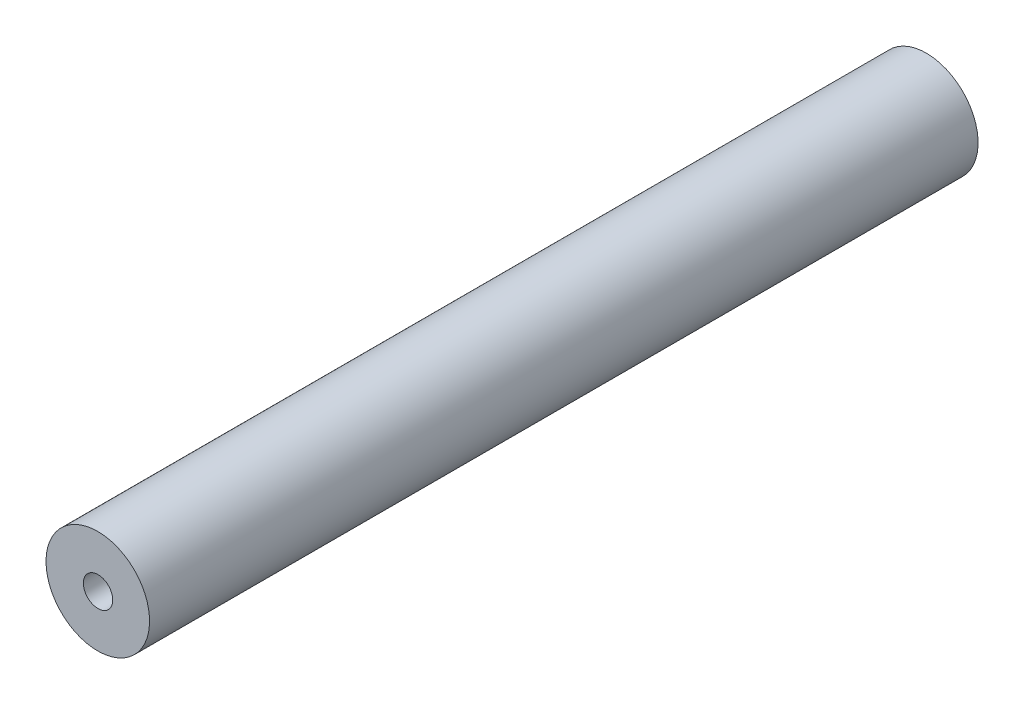
ISO-10303-21;
HEADER;
FILE_DESCRIPTION(('STEP AP214'),'2;1');
FILE_NAME('part.step','',(''),(''),'','','');
FILE_SCHEMA(('AUTOMOTIVE_DESIGN { 1 0 10303 214 1 1 1 1 }'));
ENDSEC;
DATA;
#1=APPLICATION_CONTEXT('core data for automotive mechanical design processes');
#2=APPLICATION_PROTOCOL_DEFINITION('international standard','automotive_design',2000,#1);
#3=PRODUCT_CONTEXT('',#1,'mechanical');
#4=PRODUCT('Part','Part','',(#3));
#5=PRODUCT_RELATED_PRODUCT_CATEGORY('part','',(#4));
#6=PRODUCT_DEFINITION_FORMATION('','',#4);
#7=PRODUCT_DEFINITION_CONTEXT('part definition',#1,'design');
#8=PRODUCT_DEFINITION('design','',#6,#7);
#9=PRODUCT_DEFINITION_SHAPE('','',#8);
#10=(LENGTH_UNIT() NAMED_UNIT(*) SI_UNIT(.MILLI.,.METRE.));
#11=(NAMED_UNIT(*) PLANE_ANGLE_UNIT() SI_UNIT($,.RADIAN.));
#12=(NAMED_UNIT(*) SI_UNIT($,.STERADIAN.) SOLID_ANGLE_UNIT());
#13=UNCERTAINTY_MEASURE_WITH_UNIT(LENGTH_MEASURE(1.E-05),#10,'distance_accuracy_value','');
#14=(GEOMETRIC_REPRESENTATION_CONTEXT(3) GLOBAL_UNCERTAINTY_ASSIGNED_CONTEXT((#13)) GLOBAL_UNIT_ASSIGNED_CONTEXT((#10,
#11,#12)) REPRESENTATION_CONTEXT('',''));
#15=CARTESIAN_POINT('',(0.,0.,0.));
#16=DIRECTION('',(0.,0.,1.));
#17=DIRECTION('',(1.,0.,0.));
#18=AXIS2_PLACEMENT_3D('',#15,#16,#17);
#19=CARTESIAN_POINT('',(0.,0.,76.2));
#20=DIRECTION('',(0.,0.,-1.));
#21=DIRECTION('',(-1.,0.,0.));
#22=AXIS2_PLACEMENT_3D('',#19,#20,#21);
#23=CYLINDRICAL_SURFACE('',#22,4.7625);
#24=CARTESIAN_POINT('',(0.,0.,76.2));
#25=DIRECTION('',(0.,0.,1.));
#26=DIRECTION('',(1.,0.,0.));
#27=AXIS2_PLACEMENT_3D('',#24,#25,#26);
#28=CIRCLE('',#27,4.7625);
#29=CARTESIAN_POINT('',(-4.7625,0.,76.2));
#30=VERTEX_POINT('',#29);
#31=EDGE_CURVE('E11',#30,#30,#28,.T.);
#32=CARTESIAN_POINT('',(0.,0.,0.));
#33=DIRECTION('',(0.,0.,1.));
#34=DIRECTION('',(1.,0.,0.));
#35=AXIS2_PLACEMENT_3D('',#32,#33,#34);
#36=CIRCLE('',#35,4.7625);
#37=CARTESIAN_POINT('',(-4.7625,0.,0.));
#38=VERTEX_POINT('',#37);
#39=EDGE_CURVE('E40',#38,#38,#36,.T.);
#40=CARTESIAN_POINT('',(-4.7625,0.,76.2));
#41=CARTESIAN_POINT('',(-4.7625,0.,75.40625));
#42=CARTESIAN_POINT('',(-4.7625,0.,74.6125));
#43=CARTESIAN_POINT('',(-4.7625,0.,73.025));
#44=CARTESIAN_POINT('',(-4.7625,0.,72.23125));
#45=CARTESIAN_POINT('',(-4.7625,0.,70.64375));
#46=CARTESIAN_POINT('',(-4.7625,0.,69.85));
#47=CARTESIAN_POINT('',(-4.7625,0.,68.2625));
#48=CARTESIAN_POINT('',(-4.7625,0.,67.46875));
#49=CARTESIAN_POINT('',(-4.7625,0.,65.88125));
#50=CARTESIAN_POINT('',(-4.7625,0.,65.0875));
#51=CARTESIAN_POINT('',(-4.7625,0.,63.5));
#52=CARTESIAN_POINT('',(-4.7625,0.,62.70625));
#53=CARTESIAN_POINT('',(-4.7625,0.,61.11875));
#54=CARTESIAN_POINT('',(-4.7625,0.,60.325));
#55=CARTESIAN_POINT('',(-4.7625,0.,58.7375));
#56=CARTESIAN_POINT('',(-4.7625,0.,57.94375));
#57=CARTESIAN_POINT('',(-4.7625,0.,56.35625));
#58=CARTESIAN_POINT('',(-4.7625,0.,55.5625));
#59=CARTESIAN_POINT('',(-4.7625,0.,53.975));
#60=CARTESIAN_POINT('',(-4.7625,0.,53.18125));
#61=CARTESIAN_POINT('',(-4.7625,0.,51.59375));
#62=CARTESIAN_POINT('',(-4.7625,0.,50.8));
#63=CARTESIAN_POINT('',(-4.7625,0.,49.2125));
#64=CARTESIAN_POINT('',(-4.7625,0.,48.41875));
#65=CARTESIAN_POINT('',(-4.7625,0.,46.83125));
#66=CARTESIAN_POINT('',(-4.7625,0.,46.0375));
#67=CARTESIAN_POINT('',(-4.7625,0.,44.45));
#68=CARTESIAN_POINT('',(-4.7625,0.,43.65625));
#69=CARTESIAN_POINT('',(-4.7625,0.,42.06875));
#70=CARTESIAN_POINT('',(-4.7625,0.,41.275));
#71=CARTESIAN_POINT('',(-4.7625,0.,39.6875));
#72=CARTESIAN_POINT('',(-4.7625,0.,38.89375));
#73=CARTESIAN_POINT('',(-4.7625,0.,37.30625));
#74=CARTESIAN_POINT('',(-4.7625,0.,36.5125));
#75=CARTESIAN_POINT('',(-4.7625,0.,34.925));
#76=CARTESIAN_POINT('',(-4.7625,0.,34.13125));
#77=CARTESIAN_POINT('',(-4.7625,0.,32.54375));
#78=CARTESIAN_POINT('',(-4.7625,0.,31.75));
#79=CARTESIAN_POINT('',(-4.7625,0.,30.1625));
#80=CARTESIAN_POINT('',(-4.7625,0.,29.36875));
#81=CARTESIAN_POINT('',(-4.7625,0.,27.78125));
#82=CARTESIAN_POINT('',(-4.7625,0.,26.9875));
#83=CARTESIAN_POINT('',(-4.7625,0.,25.4));
#84=CARTESIAN_POINT('',(-4.7625,0.,24.60625));
#85=CARTESIAN_POINT('',(-4.7625,0.,23.01875));
#86=CARTESIAN_POINT('',(-4.7625,0.,22.225));
#87=CARTESIAN_POINT('',(-4.7625,0.,20.6375));
#88=CARTESIAN_POINT('',(-4.7625,0.,19.84375));
#89=CARTESIAN_POINT('',(-4.7625,0.,18.25625));
#90=CARTESIAN_POINT('',(-4.7625,0.,17.4625));
#91=CARTESIAN_POINT('',(-4.7625,0.,15.875));
#92=CARTESIAN_POINT('',(-4.7625,0.,15.08125));
#93=CARTESIAN_POINT('',(-4.7625,0.,13.49375));
#94=CARTESIAN_POINT('',(-4.7625,0.,12.7));
#95=CARTESIAN_POINT('',(-4.7625,0.,11.1125));
#96=CARTESIAN_POINT('',(-4.7625,0.,10.31875));
#97=CARTESIAN_POINT('',(-4.7625,0.,8.73125));
#98=CARTESIAN_POINT('',(-4.7625,0.,7.93750000000001));
#99=CARTESIAN_POINT('',(-4.7625,0.,6.35));
#100=CARTESIAN_POINT('',(-4.7625,0.,5.55625));
#101=CARTESIAN_POINT('',(-4.7625,0.,3.96875));
#102=CARTESIAN_POINT('',(-4.7625,0.,3.175));
#103=CARTESIAN_POINT('',(-4.7625,0.,1.5875));
#104=CARTESIAN_POINT('',(-4.7625,0.,0.793750000000001));
#105=CARTESIAN_POINT('',(-4.7625,0.,0.));
#106=B_SPLINE_CURVE_WITH_KNOTS('',3,(#40,#41,#42,#43,#44,#45,#46,#47,#48,#49,#50,#51,#52,#53,
#54,#55,#56,#57,#58,#59,#60,#61,#62,#63,#64,#65,#66,#67,#68,#69,#70,#71,#72,#73,#74,#75,#76,#77,
#78,#79,#80,#81,#82,#83,#84,#85,#86,#87,#88,#89,#90,#91,#92,#93,#94,#95,#96,#97,#98,#99,#100,
#101,#102,#103,#104,#105),.UNSPECIFIED.,.F.,.F.,(4,2,2,2,2,2,2,2,2,2,2,2,2,2,2,2,2,2,2,2,2,2,2,
2,2,2,2,2,2,2,2,2,4),(0.,2.38125,4.7625,7.14375,9.52500000000001,11.90625,14.2875,16.66875,
19.05,21.43125,23.8125,26.19375,28.575,30.95625,33.3375,35.71875,38.1,40.48125,42.8625,45.24375,
47.625,50.00625,52.3875,54.76875,57.15,59.53125,61.9125,64.29375,66.675,69.05625,71.4375,
73.81875,76.2),.UNSPECIFIED.);
#107=EDGE_CURVE('BSEAM37',#30,#38,#106,.T.);
#108=ORIENTED_EDGE('',*,*,#31,.F.);
#109=ORIENTED_EDGE('',*,*,#39,.T.);
#110=ORIENTED_EDGE('',*,*,#107,.T.);
#111=ORIENTED_EDGE('',*,*,#107,.F.);
#112=EDGE_LOOP('',(#108,#110,#109,#111));
#113=FACE_BOUND('',#112,.T.);
#114=ADVANCED_FACE('F37',(#113),#23,.T.);
#115=CARTESIAN_POINT('',(0.,0.,76.2));
#116=DIRECTION('',(0.,0.,1.));
#117=DIRECTION('',(1.,0.,0.));
#118=AXIS2_PLACEMENT_3D('',#115,#116,#117);
#119=PLANE('',#118);
#120=CARTESIAN_POINT('',(0.0237407402821077,-0.0155720734169584,76.2));
#121=DIRECTION('',(0.,0.,1.));
#122=DIRECTION('',(1.,0.,0.));
#123=AXIS2_PLACEMENT_3D('',#120,#121,#122);
#124=CIRCLE('',#123,1.35254999999999);
#125=CARTESIAN_POINT('',(1.3762907402821,-0.0155720734169584,76.2));
#126=VERTEX_POINT('',#125);
#127=EDGE_CURVE('E61',#126,#126,#124,.T.);
#128=ORIENTED_EDGE('',*,*,#127,.F.);
#129=EDGE_LOOP('',(#128));
#130=FACE_BOUND('',#129,.T.);
#131=ORIENTED_EDGE('',*,*,#31,.T.);
#132=EDGE_LOOP('',(#131));
#133=FACE_BOUND('',#132,.T.);
#134=ADVANCED_FACE('F79',(#130,#133),#119,.T.);
#135=CARTESIAN_POINT('',(0.,0.,0.));
#136=DIRECTION('',(0.,0.,1.));
#137=DIRECTION('',(1.,0.,0.));
#138=AXIS2_PLACEMENT_3D('',#135,#136,#137);
#139=PLANE('',#138);
#140=CARTESIAN_POINT('',(0.0287027864569467,0.0674101084143786,0.));
#141=DIRECTION('',(0.,0.,-1.));
#142=DIRECTION('',(-1.,0.,0.));
#143=AXIS2_PLACEMENT_3D('',#140,#141,#142);
#144=CIRCLE('',#143,2.01929999999999);
#145=CARTESIAN_POINT('',(-1.99059721354304,0.0674101084143786,0.));
#146=VERTEX_POINT('',#145);
#147=EDGE_CURVE('E60',#146,#146,#144,.T.);
#148=ORIENTED_EDGE('',*,*,#147,.F.);
#149=EDGE_LOOP('',(#148));
#150=FACE_BOUND('',#149,.T.);
#151=ORIENTED_EDGE('',*,*,#39,.F.);
#152=EDGE_LOOP('',(#151));
#153=FACE_BOUND('',#152,.T.);
#154=ADVANCED_FACE('F76',(#150,#153),#139,.F.);
#155=CARTESIAN_POINT('',(0.0287027864569467,0.0674101084143786,15.24));
#156=DIRECTION('',(0.,0.,-1.));
#157=DIRECTION('',(-1.,0.,0.));
#158=AXIS2_PLACEMENT_3D('',#155,#156,#157);
#159=CONICAL_SURFACE('',#158,2.01929999999999,1.02974425867665);
#160=CARTESIAN_POINT('',(0.0287027864569427,0.0674101084143786,16.4533178480023));
#161=VERTEX_POINT('',#160);
#162=VERTEX_LOOP('',#161);
#163=FACE_BOUND('',#162,.T.);
#164=CARTESIAN_POINT('',(0.0287027864569467,0.0674101084143786,15.24));
#165=DIRECTION('',(0.,0.,-1.));
#166=DIRECTION('',(-1.,0.,0.));
#167=AXIS2_PLACEMENT_3D('',#164,#165,#166);
#168=CIRCLE('',#167,2.01929999999999);
#169=CARTESIAN_POINT('',(-1.99059721354304,0.0674101084143786,15.24));
#170=VERTEX_POINT('',#169);
#171=EDGE_CURVE('E64',#170,#170,#168,.T.);
#172=ORIENTED_EDGE('',*,*,#171,.T.);
#173=EDGE_LOOP('',(#172));
#174=FACE_BOUND('',#173,.T.);
#175=ADVANCED_FACE('F78',(#163,#174),#159,.F.);
#176=CARTESIAN_POINT('',(0.0287027864569467,0.0674101084143786,0.));
#177=DIRECTION('',(0.,0.,-1.));
#178=DIRECTION('',(-1.,0.,0.));
#179=AXIS2_PLACEMENT_3D('',#176,#177,#178);
#180=CYLINDRICAL_SURFACE('',#179,2.01929999999999);
#181=ORIENTED_EDGE('',*,*,#171,.F.);
#182=EDGE_LOOP('',(#181));
#183=FACE_BOUND('',#182,.T.);
#184=ORIENTED_EDGE('',*,*,#147,.T.);
#185=EDGE_LOOP('',(#184));
#186=FACE_BOUND('',#185,.T.);
#187=ADVANCED_FACE('F54',(#183,#186),#180,.F.);
#188=CARTESIAN_POINT('',(0.0237407402821077,-0.0155720734169584,66.802));
#189=DIRECTION('',(0.,0.,1.));
#190=DIRECTION('',(1.,0.,0.));
#191=AXIS2_PLACEMENT_3D('',#188,#189,#190);
#192=CONICAL_SURFACE('',#191,1.35255,1.02974425867665);
#193=CARTESIAN_POINT('',(0.0237407402821052,-0.0155720734169584,65.9893059697343));
#194=VERTEX_POINT('',#193);
#195=VERTEX_LOOP('',#194);
#196=FACE_BOUND('',#195,.T.);
#197=CARTESIAN_POINT('',(0.0237407402821077,-0.0155720734169584,66.802));
#198=DIRECTION('',(0.,0.,1.));
#199=DIRECTION('',(1.,0.,0.));
#200=AXIS2_PLACEMENT_3D('',#197,#198,#199);
#201=CIRCLE('',#200,1.35255);
#202=CARTESIAN_POINT('',(1.3762907402821,-0.0155720734169584,66.802));
#203=VERTEX_POINT('',#202);
#204=EDGE_CURVE('E58',#203,#203,#201,.T.);
#205=ORIENTED_EDGE('',*,*,#204,.T.);
#206=EDGE_LOOP('',(#205));
#207=FACE_BOUND('',#206,.T.);
#208=ADVANCED_FACE('F50',(#196,#207),#192,.F.);
#209=CARTESIAN_POINT('',(0.0237407402821077,-0.0155720734169584,76.2));
#210=DIRECTION('',(0.,0.,1.));
#211=DIRECTION('',(1.,0.,0.));
#212=AXIS2_PLACEMENT_3D('',#209,#210,#211);
#213=CYLINDRICAL_SURFACE('',#212,1.35254999999999);
#214=ORIENTED_EDGE('',*,*,#204,.F.);
#215=EDGE_LOOP('',(#214));
#216=FACE_BOUND('',#215,.T.);
#217=ORIENTED_EDGE('',*,*,#127,.T.);
#218=EDGE_LOOP('',(#217));
#219=FACE_BOUND('',#218,.T.);
#220=ADVANCED_FACE('F53',(#216,#219),#213,.F.);
#221=CLOSED_SHELL('',(#114,#134,#154,#175,#187,#208,#220));
#222=MANIFOLD_SOLID_BREP('B2',#221);
#223=ADVANCED_BREP_SHAPE_REPRESENTATION('',(#18,#222),#14);
#224=SHAPE_DEFINITION_REPRESENTATION(#9,#223);
ENDSEC;
END-ISO-10303-21;
